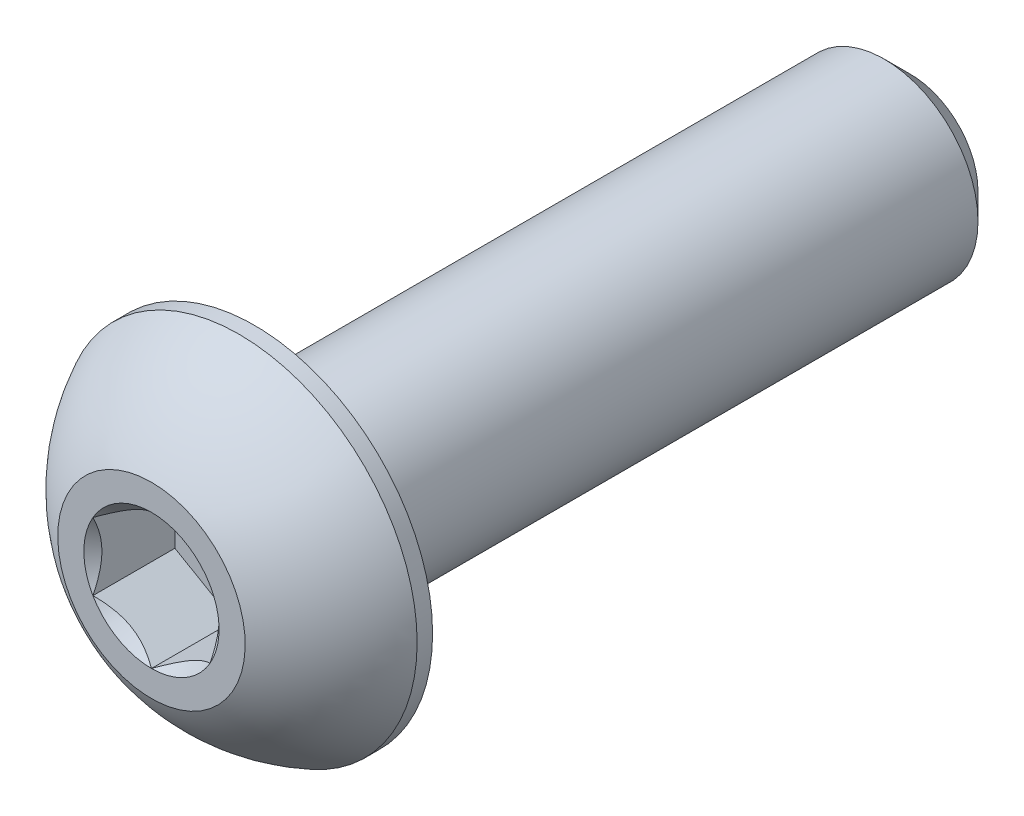
ISO-10303-21;
HEADER;
FILE_DESCRIPTION(('STEP AP214'),'2;1');
FILE_NAME('part.step','',(''),(''),'','','');
FILE_SCHEMA(('AUTOMOTIVE_DESIGN { 1 0 10303 214 1 1 1 1 }'));
ENDSEC;
DATA;
#1=APPLICATION_CONTEXT('core data for automotive mechanical design processes');
#2=APPLICATION_PROTOCOL_DEFINITION('international standard','automotive_design',2000,#1);
#3=PRODUCT_CONTEXT('',#1,'mechanical');
#4=PRODUCT('Part','Part','',(#3));
#5=PRODUCT_RELATED_PRODUCT_CATEGORY('part','',(#4));
#6=PRODUCT_DEFINITION_FORMATION('','',#4);
#7=PRODUCT_DEFINITION_CONTEXT('part definition',#1,'design');
#8=PRODUCT_DEFINITION('design','',#6,#7);
#9=PRODUCT_DEFINITION_SHAPE('','',#8);
#10=(LENGTH_UNIT() NAMED_UNIT(*) SI_UNIT(.MILLI.,.METRE.));
#11=(NAMED_UNIT(*) PLANE_ANGLE_UNIT() SI_UNIT($,.RADIAN.));
#12=(NAMED_UNIT(*) SI_UNIT($,.STERADIAN.) SOLID_ANGLE_UNIT());
#13=UNCERTAINTY_MEASURE_WITH_UNIT(LENGTH_MEASURE(1.E-05),#10,'distance_accuracy_value','');
#14=(GEOMETRIC_REPRESENTATION_CONTEXT(3) GLOBAL_UNCERTAINTY_ASSIGNED_CONTEXT((#13)) GLOBAL_UNIT_ASSIGNED_CONTEXT((#10,
#11,#12)) REPRESENTATION_CONTEXT('',''));
#15=CARTESIAN_POINT('',(0.,0.,0.));
#16=DIRECTION('',(0.,0.,1.));
#17=DIRECTION('',(1.,0.,0.));
#18=AXIS2_PLACEMENT_3D('',#15,#16,#17);
#19=CARTESIAN_POINT('',(0.,0.,8.1));
#20=DIRECTION('',(0.,0.,-1.));
#21=DIRECTION('',(-1.,0.,0.));
#22=AXIS2_PLACEMENT_3D('',#19,#20,#21);
#23=PLANE('',#22);
#24=CARTESIAN_POINT('',(0.,0.,8.1));
#25=DIRECTION('',(0.,0.,1.));
#26=DIRECTION('',(1.,0.,0.));
#27=AXIS2_PLACEMENT_3D('',#24,#25,#26);
#28=CIRCLE('',#27,1.44337567297406);
#29=CARTESIAN_POINT('',(-1.25,0.721687836487033,8.1));
#30=VERTEX_POINT('',#29);
#31=CARTESIAN_POINT('',(-1.25,-0.721687836487033,8.1));
#32=VERTEX_POINT('',#31);
#33=EDGE_CURVE('E129',#30,#32,#28,.T.);
#34=ORIENTED_EDGE('',*,*,#33,.F.);
#35=CARTESIAN_POINT('',(0.,1.44337567297406,8.1));
#36=VERTEX_POINT('',#35);
#37=EDGE_CURVE('E101',#36,#30,#28,.T.);
#38=ORIENTED_EDGE('',*,*,#37,.F.);
#39=CARTESIAN_POINT('',(1.25,0.721687836487032,8.1));
#40=VERTEX_POINT('',#39);
#41=EDGE_CURVE('E92',#40,#36,#28,.T.);
#42=ORIENTED_EDGE('',*,*,#41,.F.);
#43=CARTESIAN_POINT('',(1.25,-0.721687836487032,8.1));
#44=VERTEX_POINT('',#43);
#45=EDGE_CURVE('E53',#44,#40,#28,.T.);
#46=ORIENTED_EDGE('',*,*,#45,.F.);
#47=CARTESIAN_POINT('',(0.,-1.44337567297406,8.1));
#48=VERTEX_POINT('',#47);
#49=EDGE_CURVE('E60',#48,#44,#28,.T.);
#50=ORIENTED_EDGE('',*,*,#49,.F.);
#51=EDGE_CURVE('E130',#32,#48,#28,.T.);
#52=ORIENTED_EDGE('',*,*,#51,.F.);
#53=EDGE_LOOP('',(#34,#38,#42,#46,#50,#52));
#54=FACE_BOUND('',#53,.T.);
#55=CARTESIAN_POINT('',(0.,0.,8.1));
#56=DIRECTION('',(0.,0.,1.));
#57=DIRECTION('',(1.,0.,0.));
#58=AXIS2_PLACEMENT_3D('',#55,#56,#57);
#59=CIRCLE('',#58,1.99999999999999);
#60=CARTESIAN_POINT('',(0.,1.99999999999999,8.1));
#61=VERTEX_POINT('',#60);
#62=EDGE_CURVE('E47',#61,#61,#59,.T.);
#63=ORIENTED_EDGE('',*,*,#62,.T.);
#64=EDGE_LOOP('',(#63));
#65=FACE_BOUND('',#64,.T.);
#66=ADVANCED_FACE('F34',(#54,#65),#23,.F.);
#67=CARTESIAN_POINT('',(0.,0.,4.37355614973261));
#68=DIRECTION('',(0.,0.,1.));
#69=DIRECTION('',(0.,1.,0.));
#70=AXIS2_PLACEMENT_3D('',#67,#68,#69);
#71=SPHERICAL_SURFACE('',#70,4.22922968981298);
#72=CARTESIAN_POINT('',(0.,0.,6.23));
#73=DIRECTION('',(0.,0.,1.));
#74=DIRECTION('',(1.,0.,0.));
#75=AXIS2_PLACEMENT_3D('',#72,#73,#74);
#76=CIRCLE('',#75,3.8);
#77=CARTESIAN_POINT('',(0.,3.8,6.23));
#78=VERTEX_POINT('',#77);
#79=EDGE_CURVE('E212',#78,#78,#76,.T.);
#80=CARTESIAN_POINT('',(0.,1.99999999999999,8.1));
#81=CARTESIAN_POINT('',(0.,2.02421343985613,8.08700457403551));
#82=CARTESIAN_POINT('',(0.,2.04830018323974,8.07377308703487));
#83=CARTESIAN_POINT('',(0.,2.09621120342125,8.04684315849425));
#84=CARTESIAN_POINT('',(0.,2.12003548021916,8.03314471695427));
#85=CARTESIAN_POINT('',(0.,2.16741249358866,8.00528604686797));
#86=CARTESIAN_POINT('',(0.,2.19096523016025,7.99112581832164));
#87=CARTESIAN_POINT('',(0.,2.23779021933682,7.96234896476404));
#88=CARTESIAN_POINT('',(0.,2.2610624719418,7.94773233975278));
#89=CARTESIAN_POINT('',(0.,2.30731764886071,7.91804824448586));
#90=CARTESIAN_POINT('',(0.,2.33030057317464,7.9029807742302));
#91=CARTESIAN_POINT('',(0.,2.37596836104234,7.87240071441713));
#92=CARTESIAN_POINT('',(0.,2.39865322459611,7.85688812485971));
#93=CARTESIAN_POINT('',(0.,2.44371627121513,7.82542372060412));
#94=CARTESIAN_POINT('',(0.,2.46609445428037,7.80947190590595));
#95=CARTESIAN_POINT('',(0.,2.51053563686181,7.77713511266833));
#96=CARTESIAN_POINT('',(0.,2.532598636378,7.76075013412888));
#97=CARTESIAN_POINT('',(0.,2.57640106852491,7.72755323903277));
#98=CARTESIAN_POINT('',(0.,2.59814050115563,7.71074132247611));
#99=CARTESIAN_POINT('',(0.,2.64128753915153,7.67669693941185));
#100=CARTESIAN_POINT('',(0.,2.6626951445167,7.65946447290426));
#101=CARTESIAN_POINT('',(0.,2.70517039368395,7.62458553779703));
#102=CARTESIAN_POINT('',(0.,2.72623803748602,7.6069390691974));
#103=CARTESIAN_POINT('',(0.,2.76802535840618,7.57123883507559));
#104=CARTESIAN_POINT('',(0.,2.78874503552428,7.55318506955341));
#105=CARTESIAN_POINT('',(0.,2.82982855017313,7.51667710151719));
#106=CARTESIAN_POINT('',(0.,2.85019238770388,7.49822289900316));
#107=CARTESIAN_POINT('',(0.,2.89055648548394,7.46092106906898));
#108=CARTESIAN_POINT('',(0.,2.91055674573323,7.44207344164884));
#109=CARTESIAN_POINT('',(0.,2.95018608940552,7.40399192347873));
#110=CARTESIAN_POINT('',(0.,2.96981517282852,7.38475803272878));
#111=CARTESIAN_POINT('',(0.,3.00869470434027,7.34591129624471));
#112=CARTESIAN_POINT('',(0.,3.02794515242903,7.3262984505106));
#113=CARTESIAN_POINT('',(0.,3.06606009863533,7.28670125639627));
#114=CARTESIAN_POINT('',(0.,3.08492459675286,7.26671690801607));
#115=CARTESIAN_POINT('',(0.,3.12226047503002,7.22638430210832));
#116=CARTESIAN_POINT('',(0.,3.14073185518964,7.20603604458079));
#117=CARTESIAN_POINT('',(0.,3.17727447893821,7.16498335215256));
#118=CARTESIAN_POINT('',(0.,3.19534572252715,7.14427891725186));
#119=CARTESIAN_POINT('',(0.,3.23108120656242,7.10252173718901));
#120=CARTESIAN_POINT('',(0.,3.24874544700875,7.08146899202686));
#121=CARTESIAN_POINT('',(0.,3.28366021283673,7.03902319090103));
#122=CARTESIAN_POINT('',(0.,3.30091073821838,7.01763013493736));
#123=CARTESIAN_POINT('',(0.,3.33499151919534,6.97451184097717));
#124=CARTESIAN_POINT('',(0.,3.35182177479064,6.95278660298064));
#125=CARTESIAN_POINT('',(0.,3.38505562116371,6.9090121999432));
#126=CARTESIAN_POINT('',(0.,3.40145921194149,6.88696303490229));
#127=CARTESIAN_POINT('',(0.,3.43383349577046,6.84254915584848));
#128=CARTESIAN_POINT('',(0.,3.44980418882166,6.8201844418356));
#129=CARTESIAN_POINT('',(0.,3.48130660877275,6.77514796280767));
#130=CARTESIAN_POINT('',(0.,3.49683833567264,6.75247619779264));
#131=CARTESIAN_POINT('',(0.,3.52745692170931,6.70683423141033));
#132=CARTESIAN_POINT('',(0.,3.5425437808461,6.68386403004306));
#133=CARTESIAN_POINT('',(0.,3.57226689871518,6.63763391896935));
#134=CARTESIAN_POINT('',(0.,3.58690315744748,6.61437400926291));
#135=CARTESIAN_POINT('',(0.,3.61571951333199,6.5675733197334));
#136=CARTESIAN_POINT('',(0.,3.62989961048422,6.54403253991033));
#137=CARTESIAN_POINT('',(0.,3.65779825442823,6.4966790546141));
#138=CARTESIAN_POINT('',(0.,3.67151680122002,6.47286634914094));
#139=CARTESIAN_POINT('',(0.,3.69848713452321,6.42497806212234));
#140=CARTESIAN_POINT('',(0.,3.71173892103461,6.4009024805769));
#141=CARTESIAN_POINT('',(0.,3.73777068821038,6.35249758420785));
#142=CARTESIAN_POINT('',(0.,3.75055066887474,6.32816826938425));
#143=CARTESIAN_POINT('',(0.,3.77563400658953,6.27926517055481));
#144=CARTESIAN_POINT('',(0.,3.78793736363997,6.25469138654897));
#145=CARTESIAN_POINT('',(0.,3.8,6.23));
#146=B_SPLINE_CURVE_WITH_KNOTS('',3,(#80,#81,#82,#83,#84,#85,#86,#87,#88,#89,#90,#91,#92,#93,
#94,#95,#96,#97,#98,#99,#100,#101,#102,#103,#104,#105,#106,#107,#108,#109,#110,#111,#112,#113,
#114,#115,#116,#117,#118,#119,#120,#121,#122,#123,#124,#125,#126,#127,#128,#129,#130,#131,#132,
#133,#134,#135,#136,#137,#138,#139,#140,#141,#142,#143,#144,#145),.UNSPECIFIED.,.F.,.F.,(4,2,2,
2,2,2,2,2,2,2,2,2,2,2,2,2,2,2,2,2,2,2,2,2,2,2,2,2,2,2,2,2,4),(0.,0.0824398589102638,
0.164879717820528,0.247319576730793,0.329759435641057,0.412199294551322,0.494639153461586,
0.577079012371851,0.659518871282115,0.74195873019238,0.824398589102644,0.906838448012908,
0.989278306923172,1.07171816583344,1.1541580247437,1.23659788365397,1.31903774256423,
1.40147760147449,1.48391746038476,1.56635731929502,1.64879717820529,1.73123703711555,
1.81367689602582,1.89611675493608,1.97855661384635,2.06099647275661,2.14343633166687,
2.22587619057714,2.3083160494874,2.39075590839767,2.47319576730793,2.5556356262182,
2.63807548512846),.UNSPECIFIED.);
#147=EDGE_CURVE('BSEAM217',#61,#78,#146,.T.);
#148=ORIENTED_EDGE('',*,*,#62,.F.);
#149=ORIENTED_EDGE('',*,*,#79,.T.);
#150=ORIENTED_EDGE('',*,*,#147,.T.);
#151=ORIENTED_EDGE('',*,*,#147,.F.);
#152=EDGE_LOOP('',(#148,#150,#149,#151));
#153=FACE_BOUND('',#152,.T.);
#154=ADVANCED_FACE('F217',(#153),#71,.T.);
#155=CARTESIAN_POINT('',(0.,0.,8.1));
#156=DIRECTION('',(0.,0.,1.));
#157=DIRECTION('',(1.,0.,0.));
#158=AXIS2_PLACEMENT_3D('',#155,#156,#157);
#159=CYLINDRICAL_SURFACE('',#158,3.8);
#160=ORIENTED_EDGE('',*,*,#79,.F.);
#161=EDGE_LOOP('',(#160));
#162=FACE_BOUND('',#161,.T.);
#163=CARTESIAN_POINT('',(0.,0.,5.9));
#164=DIRECTION('',(0.,0.,1.));
#165=DIRECTION('',(1.,0.,0.));
#166=AXIS2_PLACEMENT_3D('',#163,#164,#165);
#167=CIRCLE('',#166,3.8);
#168=CARTESIAN_POINT('',(3.8,0.,5.9));
#169=VERTEX_POINT('',#168);
#170=EDGE_CURVE('E209',#169,#169,#167,.T.);
#171=ORIENTED_EDGE('',*,*,#170,.T.);
#172=EDGE_LOOP('',(#171));
#173=FACE_BOUND('',#172,.T.);
#174=ADVANCED_FACE('F220',(#162,#173),#159,.T.);
#175=CARTESIAN_POINT('',(0.,2.,5.9));
#176=DIRECTION('',(0.,0.,1.));
#177=DIRECTION('',(1.,0.,0.));
#178=AXIS2_PLACEMENT_3D('',#175,#176,#177);
#179=PLANE('',#178);
#180=ORIENTED_EDGE('',*,*,#170,.F.);
#181=EDGE_LOOP('',(#180));
#182=FACE_BOUND('',#181,.T.);
#183=CARTESIAN_POINT('',(0.,0.,5.9));
#184=DIRECTION('',(0.,0.,1.));
#185=DIRECTION('',(1.,0.,0.));
#186=AXIS2_PLACEMENT_3D('',#183,#184,#185);
#187=CIRCLE('',#186,2.);
#188=CARTESIAN_POINT('',(2.,0.,5.9));
#189=VERTEX_POINT('',#188);
#190=EDGE_CURVE('E206',#189,#189,#187,.T.);
#191=ORIENTED_EDGE('',*,*,#190,.T.);
#192=EDGE_LOOP('',(#191));
#193=FACE_BOUND('',#192,.T.);
#194=ADVANCED_FACE('F225',(#182,#193),#179,.F.);
#195=CARTESIAN_POINT('',(0.,0.,8.1));
#196=DIRECTION('',(0.,0.,1.));
#197=DIRECTION('',(1.,0.,0.));
#198=AXIS2_PLACEMENT_3D('',#195,#196,#197);
#199=CYLINDRICAL_SURFACE('',#198,2.);
#200=ORIENTED_EDGE('',*,*,#190,.F.);
#201=EDGE_LOOP('',(#200));
#202=FACE_BOUND('',#201,.T.);
#203=CARTESIAN_POINT('',(0.,0.,-7.53999999999999));
#204=DIRECTION('',(0.,0.,1.));
#205=DIRECTION('',(1.,0.,0.));
#206=AXIS2_PLACEMENT_3D('',#203,#204,#205);
#207=CIRCLE('',#206,2.);
#208=CARTESIAN_POINT('',(2.,0.,-7.53999999999999));
#209=VERTEX_POINT('',#208);
#210=EDGE_CURVE('E203',#209,#209,#207,.T.);
#211=ORIENTED_EDGE('',*,*,#210,.T.);
#212=EDGE_LOOP('',(#211));
#213=FACE_BOUND('',#212,.T.);
#214=ADVANCED_FACE('F231',(#202,#213),#199,.T.);
#215=CARTESIAN_POINT('',(0.,0.,-8.1));
#216=DIRECTION('',(0.,0.,1.));
#217=DIRECTION('',(1.,0.,0.));
#218=AXIS2_PLACEMENT_3D('',#215,#216,#217);
#219=CONICAL_SURFACE('',#218,1.44,0.785398163397441);
#220=ORIENTED_EDGE('',*,*,#210,.F.);
#221=EDGE_LOOP('',(#220));
#222=FACE_BOUND('',#221,.T.);
#223=CARTESIAN_POINT('',(0.,0.,-8.1));
#224=DIRECTION('',(0.,0.,1.));
#225=DIRECTION('',(1.,0.,0.));
#226=AXIS2_PLACEMENT_3D('',#223,#224,#225);
#227=CIRCLE('',#226,1.44);
#228=CARTESIAN_POINT('',(1.44,0.,-8.1));
#229=VERTEX_POINT('',#228);
#230=EDGE_CURVE('E190',#229,#229,#227,.T.);
#231=ORIENTED_EDGE('',*,*,#230,.T.);
#232=EDGE_LOOP('',(#231));
#233=FACE_BOUND('',#232,.T.);
#234=ADVANCED_FACE('F237',(#222,#233),#219,.T.);
#235=CARTESIAN_POINT('',(0.,0.,-8.1));
#236=DIRECTION('',(0.,0.,1.));
#237=DIRECTION('',(1.,0.,0.));
#238=AXIS2_PLACEMENT_3D('',#235,#236,#237);
#239=PLANE('',#238);
#240=ORIENTED_EDGE('',*,*,#230,.F.);
#241=EDGE_LOOP('',(#240));
#242=FACE_BOUND('',#241,.T.);
#243=ADVANCED_FACE('F163',(#242),#239,.F.);
#244=CARTESIAN_POINT('',(0.,0.,8.1));
#245=DIRECTION('',(0.,0.,1.));
#246=DIRECTION('',(1.,0.,0.));
#247=AXIS2_PLACEMENT_3D('',#244,#245,#246);
#248=CONICAL_SURFACE('',#247,1.44337567297406,0.78539816339745);
#249=ORIENTED_EDGE('',*,*,#37,.T.);
#250=CARTESIAN_POINT('',(0.000199999999999687,1.4434911430279,8.10011548390914));
#251=CARTESIAN_POINT('',(-0.0427751670715869,1.41867941875065,8.0753216680551));
#252=CARTESIAN_POINT('',(-0.0864690047459485,1.39345276980743,8.05198373441868));
#253=CARTESIAN_POINT('',(-0.175565930841943,1.34201263554194,8.00925200408454));
#254=CARTESIAN_POINT('',(-0.220977498357065,1.31579425481276,7.98988199236041));
#255=CARTESIAN_POINT('',(-0.31254782093526,1.26292610442246,7.95670048341348));
#256=CARTESIAN_POINT('',(-0.358683240175886,1.23628980770471,7.94280555905265));
#257=CARTESIAN_POINT('',(-0.451970080407593,1.18243062538508,7.92139728216064));
#258=CARTESIAN_POINT('',(-0.499118649136381,1.15520938653761,7.91386794156679));
#259=CARTESIAN_POINT('',(-0.580373556887253,1.10829684367467,7.9070744980507));
#260=CARTESIAN_POINT('',(-0.614374876627942,1.08866617256958,7.90606855910435));
#261=CARTESIAN_POINT('',(-0.682317764432478,1.04943932800611,7.90776141491132));
#262=CARTESIAN_POINT('',(-0.716259317655658,1.02984316311599,7.91046102721554));
#263=CARTESIAN_POINT('',(-0.7838148564575,0.990839954603499,7.91940893031638));
#264=CARTESIAN_POINT('',(-0.817428507286776,0.971433104248771,7.9256605258997));
#265=CARTESIAN_POINT('',(-0.884094638217814,0.932943395609905,7.9413756814139));
#266=CARTESIAN_POINT('',(-0.917146871030297,0.9138606800983,7.95084062008746));
#267=CARTESIAN_POINT('',(-1.00179969160026,0.864986351354568,7.97893139068758));
#268=CARTESIAN_POINT('',(-1.05286649242964,0.835502920149076,7.9996701574522));
#269=CARTESIAN_POINT('',(-1.15300085411325,0.777690319475909,8.04638713467148));
#270=CARTESIAN_POINT('',(-1.20207431157827,0.749357745598417,8.07234829594677));
#271=CARTESIAN_POINT('',(-1.2502,0.721572366433195,8.10011548390914));
#272=B_SPLINE_CURVE_WITH_KNOTS('',3,(#250,#251,#252,#253,#254,#255,#256,#257,#258,#259,#260,
#261,#262,#263,#264,#265,#266,#267,#268,#269,#270,#271),.UNSPECIFIED.,.F.,.F.,(4,2,2,2,2,2,2,2,
2,2,4),(0.,0.166533409618304,0.334037607289762,0.498880396489699,0.663307919240275,
0.780963963458827,0.898645970148453,1.01643764860773,1.1342799317155,1.32148652032141,
1.50809158792573),.UNSPECIFIED.);
#273=EDGE_CURVE('E11',#36,#30,#272,.T.);
#274=ORIENTED_EDGE('',*,*,#273,.F.);
#275=EDGE_LOOP('',(#249,#274));
#276=FACE_BOUND('',#275,.T.);
#277=ADVANCED_FACE('F105',(#276),#248,.F.);
#278=ORIENTED_EDGE('',*,*,#33,.T.);
#279=CARTESIAN_POINT('',(-1.25,-1.43934010808077,8.56298209689233));
#280=CARTESIAN_POINT('',(-1.25,-1.40429313005659,8.53652492263289));
#281=CARTESIAN_POINT('',(-1.25,-1.36905087135599,8.51032716035428));
#282=CARTESIAN_POINT('',(-1.25,-1.29809650706311,8.45855757183958));
#283=CARTESIAN_POINT('',(-1.25,-1.26238428576495,8.43298590435629));
#284=CARTESIAN_POINT('',(-1.25,-1.15390111792708,8.35700599368946));
#285=CARTESIAN_POINT('',(-1.25,-1.08031646726264,8.30774028618957));
#286=CARTESIAN_POINT('',(-1.25,-0.926012322755095,8.21102583026313));
#287=CARTESIAN_POINT('',(-1.25,-0.845125318656146,8.1638412989418));
#288=CARTESIAN_POINT('',(-1.25,-0.679311174076602,8.07753073439041));
#289=CARTESIAN_POINT('',(-1.25,-0.594398891026688,8.0383775346269));
#290=CARTESIAN_POINT('',(-1.25,-0.46694481246074,7.99047722368829));
#291=CARTESIAN_POINT('',(-1.25,-0.426289985812821,7.97672948978634));
#292=CARTESIAN_POINT('',(-1.25,-0.343998850091267,7.95249792745054));
#293=CARTESIAN_POINT('',(-1.25,-0.302362473614962,7.94201432386977));
#294=CARTESIAN_POINT('',(-1.25,-0.219052696285666,7.9250301617483));
#295=CARTESIAN_POINT('',(-1.25,-0.1773934284745,7.91846136047137));
#296=CARTESIAN_POINT('',(-1.25,-0.0936293693401928,7.90943505345776));
#297=CARTESIAN_POINT('',(-1.25,-0.0515246558543967,7.90697684099727));
#298=CARTESIAN_POINT('',(-1.25,0.0311890576306309,7.90635406201328));
#299=CARTESIAN_POINT('',(-1.25,0.0717969625499298,7.90803711684625));
#300=CARTESIAN_POINT('',(-1.25,0.152668636885196,7.91526827059791));
#301=CARTESIAN_POINT('',(-1.25,0.192932338835357,7.92081711041311));
#302=CARTESIAN_POINT('',(-1.25,0.273499879165294,7.93557103646495));
#303=CARTESIAN_POINT('',(-1.25,0.31379218061851,7.9448381759641));
#304=CARTESIAN_POINT('',(-1.25,0.393496413911456,7.96653617845735));
#305=CARTESIAN_POINT('',(-1.25,0.432908419115058,7.97896677673064));
#306=CARTESIAN_POINT('',(-1.25,0.556992735862297,8.02277935293144));
#307=CARTESIAN_POINT('',(-1.25,0.639898924666084,8.05915107287595));
#308=CARTESIAN_POINT('',(-1.25,0.8018165554997,8.14001916217833));
#309=CARTESIAN_POINT('',(-1.25,0.880812666325043,8.18454472091199));
#310=CARTESIAN_POINT('',(-1.25,1.0317856127975,8.27640487666662));
#311=CARTESIAN_POINT('',(-1.25,1.10391618485086,8.32348993391625));
#312=CARTESIAN_POINT('',(-1.25,1.2101860604331,8.39627856159854));
#313=CARTESIAN_POINT('',(-1.25,1.24515069969379,8.42079808539336));
#314=CARTESIAN_POINT('',(-1.25,1.31460220852736,8.47048563676568));
#315=CARTESIAN_POINT('',(-1.25,1.34908920596618,8.49565348541552));
#316=CARTESIAN_POINT('',(-1.25,1.38337731682911,8.52109014884121));
#317=B_SPLINE_CURVE_WITH_KNOTS('',3,(#279,#280,#281,#282,#283,#284,#285,#286,#287,#288,#289,
#290,#291,#292,#293,#294,#295,#296,#297,#298,#299,#300,#301,#302,#303,#304,#305,#306,#307,#308,
#309,#310,#311,#312,#313,#314,#315,#316),.UNSPECIFIED.,.F.,.F.,(4,2,2,2,2,2,2,2,2,2,2,2,2,2,2,2,
2,2,4),(0.,0.131732960381448,0.263498984161645,0.529042014455826,0.80974192613462,
1.08947609717225,1.21811634272577,1.346765447839,1.47310084517844,1.59941451973784,
1.72115042167849,1.84290966131735,1.96679153905342,2.09066305366039,2.36146692896009,
2.63325989198491,2.89154668212279,3.01965734507713,3.14773302245628),.UNSPECIFIED.);
#318=EDGE_CURVE('E100',#30,#32,#317,.F.);
#319=ORIENTED_EDGE('',*,*,#318,.F.);
#320=EDGE_LOOP('',(#278,#319));
#321=FACE_BOUND('',#320,.T.);
#322=ADVANCED_FACE('F249',(#321),#248,.F.);
#323=ORIENTED_EDGE('',*,*,#51,.T.);
#324=CARTESIAN_POINT('',(-1.2502,-0.721572366433194,8.10011548390914));
#325=CARTESIAN_POINT('',(-1.20722483292841,-0.746384090710444,8.0753216680551));
#326=CARTESIAN_POINT('',(-1.16353099525405,-0.771610739653665,8.05198373441868));
#327=CARTESIAN_POINT('',(-1.07443406915806,-0.823050873919155,8.00925200408454));
#328=CARTESIAN_POINT('',(-1.02902250164294,-0.849269254648334,7.98988199236041));
#329=CARTESIAN_POINT('',(-0.937452179064739,-0.902137405038636,7.95670048341348));
#330=CARTESIAN_POINT('',(-0.891316759824114,-0.928773701756387,7.94280555905265));
#331=CARTESIAN_POINT('',(-0.798029919592407,-0.982632884076013,7.92139728216064));
#332=CARTESIAN_POINT('',(-0.750881350863619,-1.00985412292348,7.91386794156679));
#333=CARTESIAN_POINT('',(-0.669626443112747,-1.05676666578643,7.9070744980507));
#334=CARTESIAN_POINT('',(-0.635625123372058,-1.07639733689152,7.90606855910435));
#335=CARTESIAN_POINT('',(-0.567682235567522,-1.11562418145499,7.90776141491132));
#336=CARTESIAN_POINT('',(-0.533740682344342,-1.1352203463451,7.91046102721554));
#337=CARTESIAN_POINT('',(-0.4661851435425,-1.1742235548576,7.91940893031638));
#338=CARTESIAN_POINT('',(-0.432571492713224,-1.19363040521233,7.9256605258997));
#339=CARTESIAN_POINT('',(-0.365905361782186,-1.23212011385119,7.9413756814139));
#340=CARTESIAN_POINT('',(-0.332853128969704,-1.2512028293628,7.95084062008746));
#341=CARTESIAN_POINT('',(-0.248200308399735,-1.30007715810653,7.97893139068758));
#342=CARTESIAN_POINT('',(-0.197133507570361,-1.32956058931202,7.9996701574522));
#343=CARTESIAN_POINT('',(-0.0969991458867454,-1.38737318998519,8.04638713467148));
#344=CARTESIAN_POINT('',(-0.0479256884217311,-1.41570576386268,8.07234829594677));
#345=CARTESIAN_POINT('',(0.000199999999999445,-1.4434911430279,8.10011548390914));
#346=B_SPLINE_CURVE_WITH_KNOTS('',3,(#324,#325,#326,#327,#328,#329,#330,#331,#332,#333,#334,
#335,#336,#337,#338,#339,#340,#341,#342,#343,#344,#345),.UNSPECIFIED.,.F.,.F.,(4,2,2,2,2,2,2,2,
2,2,4),(0.,0.166533409618305,0.334037607289762,0.498880396489699,0.663307919240275,
0.780963963458827,0.898645970148454,1.01643764860773,1.1342799317155,1.32148652032141,
1.50809158792573),.UNSPECIFIED.);
#347=EDGE_CURVE('E139',#32,#48,#346,.T.);
#348=ORIENTED_EDGE('',*,*,#347,.F.);
#349=EDGE_LOOP('',(#323,#348));
#350=FACE_BOUND('',#349,.T.);
#351=ADVANCED_FACE('F351',(#350),#248,.F.);
#352=ORIENTED_EDGE('',*,*,#49,.T.);
#353=CARTESIAN_POINT('',(-0.000200000000000272,-1.4434911430279,8.10011548390914));
#354=CARTESIAN_POINT('',(0.0427751670715867,-1.41867941875065,8.0753216680551));
#355=CARTESIAN_POINT('',(0.0864690047459484,-1.39345276980743,8.05198373441868));
#356=CARTESIAN_POINT('',(0.175565930841943,-1.34201263554194,8.00925200408454));
#357=CARTESIAN_POINT('',(0.220977498357065,-1.31579425481276,7.98988199236041));
#358=CARTESIAN_POINT('',(0.31254782093526,-1.26292610442246,7.95670048341348));
#359=CARTESIAN_POINT('',(0.358683240175886,-1.23628980770471,7.94280555905265));
#360=CARTESIAN_POINT('',(0.451970080407593,-1.18243062538508,7.92139728216064));
#361=CARTESIAN_POINT('',(0.49911864913638,-1.15520938653761,7.91386794156679));
#362=CARTESIAN_POINT('',(0.580373556887253,-1.10829684367467,7.9070744980507));
#363=CARTESIAN_POINT('',(0.614374876627942,-1.08866617256958,7.90606855910435));
#364=CARTESIAN_POINT('',(0.682317764432478,-1.04943932800611,7.90776141491132));
#365=CARTESIAN_POINT('',(0.716259317655658,-1.02984316311599,7.91046102721554));
#366=CARTESIAN_POINT('',(0.7838148564575,-0.990839954603498,7.91940893031638));
#367=CARTESIAN_POINT('',(0.817428507286776,-0.97143310424877,7.9256605258997));
#368=CARTESIAN_POINT('',(0.884094638217814,-0.932943395609904,7.9413756814139));
#369=CARTESIAN_POINT('',(0.917146871030297,-0.9138606800983,7.95084062008746));
#370=CARTESIAN_POINT('',(1.00179969160026,-0.864986351354567,7.97893139068758));
#371=CARTESIAN_POINT('',(1.05286649242964,-0.835502920149076,7.9996701574522));
#372=CARTESIAN_POINT('',(1.15300085411325,-0.777690319475909,8.04638713467148));
#373=CARTESIAN_POINT('',(1.20207431157827,-0.749357745598417,8.07234829594677));
#374=CARTESIAN_POINT('',(1.2502,-0.721572366433194,8.10011548390914));
#375=B_SPLINE_CURVE_WITH_KNOTS('',3,(#353,#354,#355,#356,#357,#358,#359,#360,#361,#362,#363,
#364,#365,#366,#367,#368,#369,#370,#371,#372,#373,#374),.UNSPECIFIED.,.F.,.F.,(4,2,2,2,2,2,2,2,
2,2,4),(0.,0.166533409618305,0.334037607289762,0.498880396489699,0.663307919240275,
0.780963963458828,0.898645970148454,1.01643764860773,1.1342799317155,1.32148652032141,
1.50809158792573),.UNSPECIFIED.);
#376=EDGE_CURVE('E340',#48,#44,#375,.T.);
#377=ORIENTED_EDGE('',*,*,#376,.F.);
#378=EDGE_LOOP('',(#352,#377));
#379=FACE_BOUND('',#378,.T.);
#380=ADVANCED_FACE('F352',(#379),#248,.F.);
#381=ORIENTED_EDGE('',*,*,#45,.T.);
#382=CARTESIAN_POINT('',(1.25,-1.43934010808077,8.56298209689233));
#383=CARTESIAN_POINT('',(1.25,-1.40429313005659,8.53652492263289));
#384=CARTESIAN_POINT('',(1.25,-1.36905087135599,8.51032716035428));
#385=CARTESIAN_POINT('',(1.25,-1.29809650706311,8.45855757183958));
#386=CARTESIAN_POINT('',(1.25,-1.26238428576495,8.43298590435629));
#387=CARTESIAN_POINT('',(1.25,-1.15390111792708,8.35700599368946));
#388=CARTESIAN_POINT('',(1.25,-1.08031646726264,8.30774028618957));
#389=CARTESIAN_POINT('',(1.25,-0.926012322755094,8.21102583026313));
#390=CARTESIAN_POINT('',(1.25,-0.845125318656145,8.1638412989418));
#391=CARTESIAN_POINT('',(1.25,-0.679311174076601,8.07753073439041));
#392=CARTESIAN_POINT('',(1.25,-0.594398891026687,8.0383775346269));
#393=CARTESIAN_POINT('',(1.25,-0.466944812460739,7.99047722368829));
#394=CARTESIAN_POINT('',(1.25,-0.426289985812821,7.97672948978634));
#395=CARTESIAN_POINT('',(1.25,-0.343998850091267,7.95249792745054));
#396=CARTESIAN_POINT('',(1.25,-0.302362473614961,7.94201432386977));
#397=CARTESIAN_POINT('',(1.25,-0.219052696285665,7.9250301617483));
#398=CARTESIAN_POINT('',(1.25,-0.1773934284745,7.91846136047137));
#399=CARTESIAN_POINT('',(1.25,-0.0936293693401918,7.90943505345776));
#400=CARTESIAN_POINT('',(1.25,-0.0515246558543957,7.90697684099727));
#401=CARTESIAN_POINT('',(1.25,0.0311890576306319,7.90635406201328));
#402=CARTESIAN_POINT('',(1.25,0.0717969625499308,7.90803711684625));
#403=CARTESIAN_POINT('',(1.25,0.152668636885198,7.91526827059791));
#404=CARTESIAN_POINT('',(1.25,0.192932338835358,7.92081711041311));
#405=CARTESIAN_POINT('',(1.25,0.273499879165296,7.93557103646495));
#406=CARTESIAN_POINT('',(1.25,0.313792180618512,7.9448381759641));
#407=CARTESIAN_POINT('',(1.25,0.393496413911458,7.96653617845735));
#408=CARTESIAN_POINT('',(1.25,0.432908419115059,7.97896677673064));
#409=CARTESIAN_POINT('',(1.25,0.556992735862298,8.02277935293144));
#410=CARTESIAN_POINT('',(1.25,0.639898924666085,8.05915107287596));
#411=CARTESIAN_POINT('',(1.25,0.801816555499701,8.14001916217834));
#412=CARTESIAN_POINT('',(1.25,0.880812666325045,8.18454472091199));
#413=CARTESIAN_POINT('',(1.25,1.0317856127975,8.27640487666662));
#414=CARTESIAN_POINT('',(1.25,1.10391618485086,8.32348993391625));
#415=CARTESIAN_POINT('',(1.25,1.2101860604331,8.39627856159854));
#416=CARTESIAN_POINT('',(1.25,1.24515069969379,8.42079808539336));
#417=CARTESIAN_POINT('',(1.25,1.31460220852736,8.47048563676568));
#418=CARTESIAN_POINT('',(1.25,1.34908920596618,8.49565348541552));
#419=CARTESIAN_POINT('',(1.25,1.38337731682912,8.52109014884121));
#420=B_SPLINE_CURVE_WITH_KNOTS('',3,(#382,#383,#384,#385,#386,#387,#388,#389,#390,#391,#392,
#393,#394,#395,#396,#397,#398,#399,#400,#401,#402,#403,#404,#405,#406,#407,#408,#409,#410,#411,
#412,#413,#414,#415,#416,#417,#418,#419),.UNSPECIFIED.,.F.,.F.,(4,2,2,2,2,2,2,2,2,2,2,2,2,2,2,2,
2,2,4),(0.,0.131732960381448,0.263498984161644,0.529042014455826,0.80974192613462,
1.08947609717225,1.21811634272577,1.346765447839,1.47310084517844,1.59941451973784,
1.72115042167849,1.84290966131735,1.96679153905342,2.09066305366039,2.36146692896009,
2.63325989198491,2.89154668212279,3.01965734507713,3.14773302245628),.UNSPECIFIED.);
#421=EDGE_CURVE('E117',#44,#40,#420,.T.);
#422=ORIENTED_EDGE('',*,*,#421,.F.);
#423=EDGE_LOOP('',(#381,#422));
#424=FACE_BOUND('',#423,.T.);
#425=ADVANCED_FACE('F354',(#424),#248,.F.);
#426=ORIENTED_EDGE('',*,*,#41,.T.);
#427=CARTESIAN_POINT('',(1.2502,0.721572366433194,8.10011548390914));
#428=CARTESIAN_POINT('',(1.20722483292841,0.746384090710444,8.0753216680551));
#429=CARTESIAN_POINT('',(1.16353099525405,0.771610739653664,8.05198373441868));
#430=CARTESIAN_POINT('',(1.07443406915806,0.823050873919155,8.00925200408454));
#431=CARTESIAN_POINT('',(1.02902250164294,0.849269254648334,7.98988199236041));
#432=CARTESIAN_POINT('',(0.937452179064739,0.902137405038636,7.95670048341348));
#433=CARTESIAN_POINT('',(0.891316759824113,0.928773701756388,7.94280555905265));
#434=CARTESIAN_POINT('',(0.798029919592406,0.982632884076013,7.92139728216064));
#435=CARTESIAN_POINT('',(0.750881350863619,1.00985412292348,7.91386794156679));
#436=CARTESIAN_POINT('',(0.669626443112747,1.05676666578643,7.9070744980507));
#437=CARTESIAN_POINT('',(0.635625123372058,1.07639733689152,7.90606855910435));
#438=CARTESIAN_POINT('',(0.567682235567522,1.11562418145499,7.90776141491132));
#439=CARTESIAN_POINT('',(0.533740682344342,1.1352203463451,7.91046102721554));
#440=CARTESIAN_POINT('',(0.4661851435425,1.1742235548576,7.91940893031638));
#441=CARTESIAN_POINT('',(0.432571492713224,1.19363040521233,7.9256605258997));
#442=CARTESIAN_POINT('',(0.365905361782186,1.23212011385119,7.9413756814139));
#443=CARTESIAN_POINT('',(0.332853128969703,1.2512028293628,7.95084062008746));
#444=CARTESIAN_POINT('',(0.248200308399735,1.30007715810653,7.97893139068758));
#445=CARTESIAN_POINT('',(0.197133507570361,1.32956058931202,7.9996701574522));
#446=CARTESIAN_POINT('',(0.096999145886745,1.38737318998519,8.04638713467148));
#447=CARTESIAN_POINT('',(0.0479256884217306,1.41570576386268,8.07234829594677));
#448=CARTESIAN_POINT('',(-0.000199999999999886,1.4434911430279,8.10011548390914));
#449=B_SPLINE_CURVE_WITH_KNOTS('',3,(#427,#428,#429,#430,#431,#432,#433,#434,#435,#436,#437,
#438,#439,#440,#441,#442,#443,#444,#445,#446,#447,#448),.UNSPECIFIED.,.F.,.F.,(4,2,2,2,2,2,2,2,
2,2,4),(0.,0.166533409618304,0.334037607289763,0.498880396489699,0.663307919240275,
0.780963963458827,0.898645970148454,1.01643764860773,1.1342799317155,1.32148652032141,
1.50809158792573),.UNSPECIFIED.);
#450=EDGE_CURVE('E96',#40,#36,#449,.T.);
#451=ORIENTED_EDGE('',*,*,#450,.F.);
#452=EDGE_LOOP('',(#426,#451));
#453=FACE_BOUND('',#452,.T.);
#454=ADVANCED_FACE('F94',(#453),#248,.F.);
#455=CARTESIAN_POINT('',(0.,0.,6.35));
#456=DIRECTION('',(0.,0.,1.));
#457=DIRECTION('',(1.,0.,0.));
#458=AXIS2_PLACEMENT_3D('',#455,#456,#457);
#459=PLANE('',#458);
#460=DIRECTION('',(-0.866025403784439,0.5,0.));
#461=VECTOR('',#460,1.);
#462=CARTESIAN_POINT('',(1.25,0.721687836487032,6.35));
#463=LINE('',#462,#461);
#464=CARTESIAN_POINT('',(1.25,0.721687836487032,6.35));
#465=VERTEX_POINT('',#464);
#466=CARTESIAN_POINT('',(0.,1.44337567297406,6.35));
#467=VERTEX_POINT('',#466);
#468=EDGE_CURVE('E116',#465,#467,#463,.T.);
#469=ORIENTED_EDGE('',*,*,#468,.T.);
#470=DIRECTION('',(-0.866025403784439,-0.5,0.));
#471=VECTOR('',#470,1.);
#472=CARTESIAN_POINT('',(0.,1.44337567297406,6.35));
#473=LINE('',#472,#471);
#474=CARTESIAN_POINT('',(-1.25,0.721687836487033,6.35));
#475=VERTEX_POINT('',#474);
#476=EDGE_CURVE('E121',#467,#475,#473,.T.);
#477=ORIENTED_EDGE('',*,*,#476,.T.);
#478=DIRECTION('',(0.,-1.,0.));
#479=VECTOR('',#478,1.);
#480=CARTESIAN_POINT('',(-1.25,0.721687836487033,6.35));
#481=LINE('',#480,#479);
#482=CARTESIAN_POINT('',(-1.25,-0.721687836487032,6.35));
#483=VERTEX_POINT('',#482);
#484=EDGE_CURVE('E178',#475,#483,#481,.T.);
#485=ORIENTED_EDGE('',*,*,#484,.T.);
#486=DIRECTION('',(0.866025403784439,-0.5,0.));
#487=VECTOR('',#486,1.);
#488=CARTESIAN_POINT('',(-1.25,-0.721687836487032,6.35));
#489=LINE('',#488,#487);
#490=CARTESIAN_POINT('',(0.,-1.44337567297406,6.35));
#491=VERTEX_POINT('',#490);
#492=EDGE_CURVE('E181',#483,#491,#489,.T.);
#493=ORIENTED_EDGE('',*,*,#492,.T.);
#494=DIRECTION('',(0.866025403784439,0.5,0.));
#495=VECTOR('',#494,1.);
#496=CARTESIAN_POINT('',(0.,-1.44337567297406,6.35));
#497=LINE('',#496,#495);
#498=CARTESIAN_POINT('',(1.25,-0.721687836487032,6.35));
#499=VERTEX_POINT('',#498);
#500=EDGE_CURVE('E184',#491,#499,#497,.T.);
#501=ORIENTED_EDGE('',*,*,#500,.T.);
#502=DIRECTION('',(0.,1.,0.));
#503=VECTOR('',#502,1.);
#504=CARTESIAN_POINT('',(1.25,-0.721687836487032,6.35));
#505=LINE('',#504,#503);
#506=EDGE_CURVE('E124',#499,#465,#505,.T.);
#507=ORIENTED_EDGE('',*,*,#506,.T.);
#508=EDGE_LOOP('',(#469,#477,#485,#493,#501,#507));
#509=FACE_BOUND('',#508,.T.);
#510=ADVANCED_FACE('F158',(#509),#459,.T.);
#511=CARTESIAN_POINT('',(0.,1.44337567297406,6.35));
#512=DIRECTION('',(-0.5,0.866025403784439,0.));
#513=DIRECTION('',(-0.866025403784439,-0.5,0.));
#514=AXIS2_PLACEMENT_3D('',#511,#512,#513);
#515=PLANE('',#514);
#516=DIRECTION('',(0.,0.,1.));
#517=VECTOR('',#516,1.);
#518=CARTESIAN_POINT('',(0.,1.44337567297406,6.35));
#519=LINE('',#518,#517);
#520=EDGE_CURVE('E113',#467,#36,#519,.T.);
#521=ORIENTED_EDGE('',*,*,#520,.T.);
#522=ORIENTED_EDGE('',*,*,#273,.T.);
#523=DIRECTION('',(0.,0.,1.));
#524=VECTOR('',#523,1.);
#525=CARTESIAN_POINT('',(-1.25,0.721687836487033,6.35));
#526=LINE('',#525,#524);
#527=EDGE_CURVE('E123',#475,#30,#526,.T.);
#528=ORIENTED_EDGE('',*,*,#527,.F.);
#529=ORIENTED_EDGE('',*,*,#476,.F.);
#530=EDGE_LOOP('',(#521,#522,#528,#529));
#531=FACE_BOUND('',#530,.T.);
#532=ADVANCED_FACE('F119',(#531),#515,.F.);
#533=CARTESIAN_POINT('',(-1.25,0.721687836487033,6.35));
#534=DIRECTION('',(-1.,0.,0.));
#535=DIRECTION('',(0.,0.,1.));
#536=AXIS2_PLACEMENT_3D('',#533,#534,#535);
#537=PLANE('',#536);
#538=ORIENTED_EDGE('',*,*,#527,.T.);
#539=ORIENTED_EDGE('',*,*,#318,.T.);
#540=DIRECTION('',(0.,0.,1.));
#541=VECTOR('',#540,1.);
#542=CARTESIAN_POINT('',(-1.25,-0.721687836487032,6.35));
#543=LINE('',#542,#541);
#544=EDGE_CURVE('E197',#483,#32,#543,.T.);
#545=ORIENTED_EDGE('',*,*,#544,.F.);
#546=ORIENTED_EDGE('',*,*,#484,.F.);
#547=EDGE_LOOP('',(#538,#539,#545,#546));
#548=FACE_BOUND('',#547,.T.);
#549=ADVANCED_FACE('F148',(#548),#537,.F.);
#550=CARTESIAN_POINT('',(-1.25,-0.721687836487032,6.35));
#551=DIRECTION('',(-0.5,-0.866025403784438,0.));
#552=DIRECTION('',(0.866025403784439,-0.5,0.));
#553=AXIS2_PLACEMENT_3D('',#550,#551,#552);
#554=PLANE('',#553);
#555=ORIENTED_EDGE('',*,*,#544,.T.);
#556=ORIENTED_EDGE('',*,*,#347,.T.);
#557=DIRECTION('',(0.,0.,1.));
#558=VECTOR('',#557,1.);
#559=CARTESIAN_POINT('',(0.,-1.44337567297406,6.35));
#560=LINE('',#559,#558);
#561=EDGE_CURVE('E194',#491,#48,#560,.T.);
#562=ORIENTED_EDGE('',*,*,#561,.F.);
#563=ORIENTED_EDGE('',*,*,#492,.F.);
#564=EDGE_LOOP('',(#555,#556,#562,#563));
#565=FACE_BOUND('',#564,.T.);
#566=ADVANCED_FACE('F151',(#565),#554,.F.);
#567=CARTESIAN_POINT('',(0.,-1.44337567297406,6.35));
#568=DIRECTION('',(0.5,-0.866025403784439,0.));
#569=DIRECTION('',(0.866025403784439,0.5,0.));
#570=AXIS2_PLACEMENT_3D('',#567,#568,#569);
#571=PLANE('',#570);
#572=ORIENTED_EDGE('',*,*,#561,.T.);
#573=ORIENTED_EDGE('',*,*,#376,.T.);
#574=DIRECTION('',(0.,0.,1.));
#575=VECTOR('',#574,1.);
#576=CARTESIAN_POINT('',(1.25,-0.721687836487032,6.35));
#577=LINE('',#576,#575);
#578=EDGE_CURVE('E191',#499,#44,#577,.T.);
#579=ORIENTED_EDGE('',*,*,#578,.F.);
#580=ORIENTED_EDGE('',*,*,#500,.F.);
#581=EDGE_LOOP('',(#572,#573,#579,#580));
#582=FACE_BOUND('',#581,.T.);
#583=ADVANCED_FACE('F308',(#582),#571,.F.);
#584=CARTESIAN_POINT('',(1.25,-0.721687836487032,6.35));
#585=DIRECTION('',(1.,0.,0.));
#586=DIRECTION('',(0.,1.,0.));
#587=AXIS2_PLACEMENT_3D('',#584,#585,#586);
#588=PLANE('',#587);
#589=ORIENTED_EDGE('',*,*,#578,.T.);
#590=ORIENTED_EDGE('',*,*,#421,.T.);
#591=DIRECTION('',(0.,0.,1.));
#592=VECTOR('',#591,1.);
#593=CARTESIAN_POINT('',(1.25,0.721687836487032,6.35));
#594=LINE('',#593,#592);
#595=EDGE_CURVE('E115',#465,#40,#594,.T.);
#596=ORIENTED_EDGE('',*,*,#595,.F.);
#597=ORIENTED_EDGE('',*,*,#506,.F.);
#598=EDGE_LOOP('',(#589,#590,#596,#597));
#599=FACE_BOUND('',#598,.T.);
#600=ADVANCED_FACE('F162',(#599),#588,.F.);
#601=CARTESIAN_POINT('',(1.25,0.721687836487032,6.35));
#602=DIRECTION('',(0.5,0.866025403784439,0.));
#603=DIRECTION('',(-0.866025403784439,0.5,0.));
#604=AXIS2_PLACEMENT_3D('',#601,#602,#603);
#605=PLANE('',#604);
#606=ORIENTED_EDGE('',*,*,#595,.T.);
#607=ORIENTED_EDGE('',*,*,#450,.T.);
#608=ORIENTED_EDGE('',*,*,#520,.F.);
#609=ORIENTED_EDGE('',*,*,#468,.F.);
#610=EDGE_LOOP('',(#606,#607,#608,#609));
#611=FACE_BOUND('',#610,.T.);
#612=ADVANCED_FACE('F111',(#611),#605,.F.);
#613=CLOSED_SHELL('',(#66,#154,#174,#194,#214,#234,#243,#277,#322,#351,#380,#425,#454,#510,#532,
#549,#566,#583,#600,#612));
#614=MANIFOLD_SOLID_BREP('B2',#613);
#615=ADVANCED_BREP_SHAPE_REPRESENTATION('',(#18,#614),#14);
#616=SHAPE_DEFINITION_REPRESENTATION(#9,#615);
ENDSEC;
END-ISO-10303-21;
